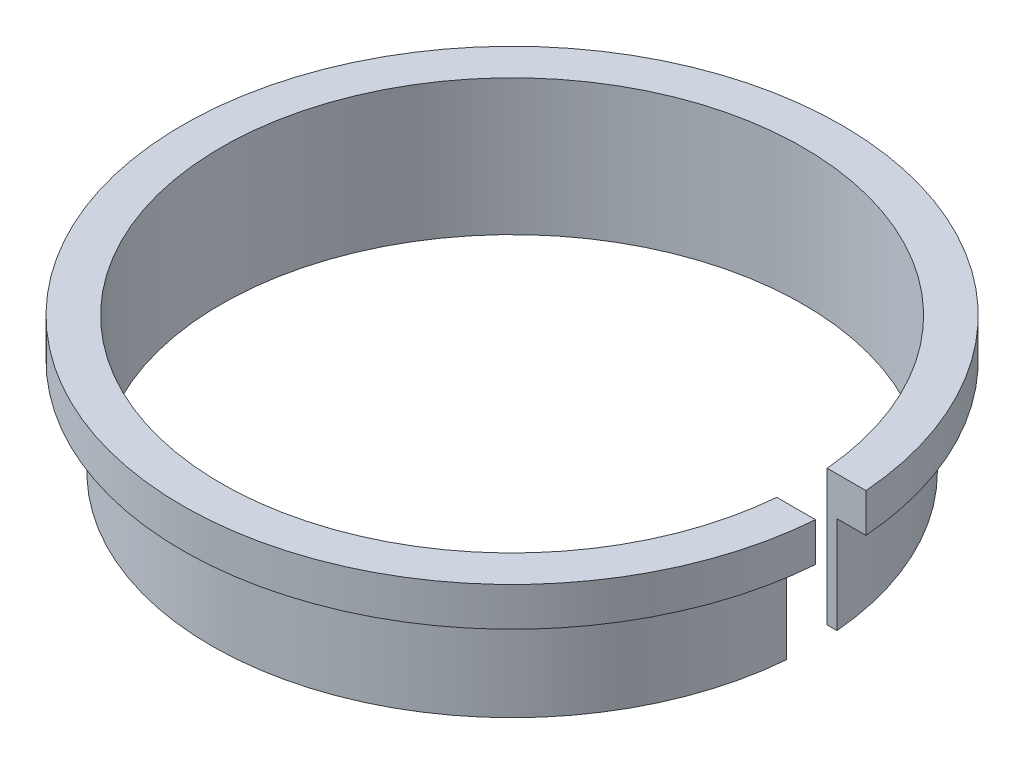
ISO-10303-21;
HEADER;
FILE_DESCRIPTION(('STEP AP214'),'2;1');
FILE_NAME('part.step','',(''),(''),'','','');
FILE_SCHEMA(('AUTOMOTIVE_DESIGN { 1 0 10303 214 1 1 1 1 }'));
ENDSEC;
DATA;
#1=APPLICATION_CONTEXT('core data for automotive mechanical design processes');
#2=APPLICATION_PROTOCOL_DEFINITION('international standard','automotive_design',2000,#1);
#3=PRODUCT_CONTEXT('',#1,'mechanical');
#4=PRODUCT('Part','Part','',(#3));
#5=PRODUCT_RELATED_PRODUCT_CATEGORY('part','',(#4));
#6=PRODUCT_DEFINITION_FORMATION('','',#4);
#7=PRODUCT_DEFINITION_CONTEXT('part definition',#1,'design');
#8=PRODUCT_DEFINITION('design','',#6,#7);
#9=PRODUCT_DEFINITION_SHAPE('','',#8);
#10=(LENGTH_UNIT() NAMED_UNIT(*) SI_UNIT(.MILLI.,.METRE.));
#11=(NAMED_UNIT(*) PLANE_ANGLE_UNIT() SI_UNIT($,.RADIAN.));
#12=(NAMED_UNIT(*) SI_UNIT($,.STERADIAN.) SOLID_ANGLE_UNIT());
#13=UNCERTAINTY_MEASURE_WITH_UNIT(LENGTH_MEASURE(1.E-05),#10,'distance_accuracy_value','');
#14=(GEOMETRIC_REPRESENTATION_CONTEXT(3) GLOBAL_UNCERTAINTY_ASSIGNED_CONTEXT((#13)) GLOBAL_UNIT_ASSIGNED_CONTEXT((#10,
#11,#12)) REPRESENTATION_CONTEXT('',''));
#15=CARTESIAN_POINT('',(0.,0.,0.));
#16=DIRECTION('',(0.,0.,1.));
#17=DIRECTION('',(1.,0.,0.));
#18=AXIS2_PLACEMENT_3D('',#15,#16,#17);
#19=CARTESIAN_POINT('',(0.,7.,0.));
#20=DIRECTION('',(0.,-1.,0.));
#21=DIRECTION('',(0.,0.,-1.));
#22=AXIS2_PLACEMENT_3D('',#19,#20,#21);
#23=CYLINDRICAL_SURFACE('',#22,15.5);
#24=CARTESIAN_POINT('',(0.,5.,0.));
#25=DIRECTION('',(0.,1.,0.));
#26=DIRECTION('',(0.,0.,1.));
#27=AXIS2_PLACEMENT_3D('',#24,#25,#26);
#28=CIRCLE('',#27,15.5);
#29=CARTESIAN_POINT('',(15.4454612043098,5.,-1.2991259316015));
#30=VERTEX_POINT('',#29);
#31=CARTESIAN_POINT('',(15.4454612043098,5.,1.2991259316015));
#32=VERTEX_POINT('',#31);
#33=EDGE_CURVE('E120',#30,#32,#28,.T.);
#34=ORIENTED_EDGE('',*,*,#33,.F.);
#35=DIRECTION('',(0.,-1.,0.));
#36=VECTOR('',#35,1.);
#37=CARTESIAN_POINT('',(15.4454612043098,7.,-1.2991259316015));
#38=LINE('',#37,#36);
#39=CARTESIAN_POINT('',(15.4454612043098,0.,-1.2991259316015));
#40=VERTEX_POINT('',#39);
#41=EDGE_CURVE('E63',#30,#40,#38,.T.);
#42=ORIENTED_EDGE('',*,*,#41,.T.);
#43=CARTESIAN_POINT('',(0.,0.,0.));
#44=DIRECTION('',(0.,1.,0.));
#45=DIRECTION('',(0.,0.,1.));
#46=AXIS2_PLACEMENT_3D('',#43,#44,#45);
#47=CIRCLE('',#46,15.5);
#48=CARTESIAN_POINT('',(15.4454612043098,0.,1.2991259316015));
#49=VERTEX_POINT('',#48);
#50=EDGE_CURVE('E116',#40,#49,#47,.T.);
#51=ORIENTED_EDGE('',*,*,#50,.T.);
#52=DIRECTION('',(0.,-1.,0.));
#53=VECTOR('',#52,1.);
#54=CARTESIAN_POINT('',(15.4454612043098,7.,1.2991259316015));
#55=LINE('',#54,#53);
#56=EDGE_CURVE('E101',#49,#32,#55,.F.);
#57=ORIENTED_EDGE('',*,*,#56,.T.);
#58=EDGE_LOOP('',(#34,#42,#51,#57));
#59=FACE_BOUND('',#58,.T.);
#60=ADVANCED_FACE('F41',(#59),#23,.T.);
#61=CARTESIAN_POINT('',(0.,7.,0.));
#62=DIRECTION('',(0.,1.,0.));
#63=DIRECTION('',(0.,0.,1.));
#64=AXIS2_PLACEMENT_3D('',#61,#62,#63);
#65=PLANE('',#64);
#66=DIRECTION('',(1.,0.,0.));
#67=VECTOR('',#66,1.);
#68=CARTESIAN_POINT('',(6.99,7.,-1.2991259316015));
#69=LINE('',#68,#67);
#70=CARTESIAN_POINT('',(14.9436364989865,7.,-1.2991259316015));
#71=VERTEX_POINT('',#70);
#72=CARTESIAN_POINT('',(16.9402589063403,7.,-1.2991259316015));
#73=VERTEX_POINT('',#72);
#74=EDGE_CURVE('E111',#71,#73,#69,.T.);
#75=ORIENTED_EDGE('',*,*,#74,.T.);
#76=CARTESIAN_POINT('',(0.,7.,0.));
#77=DIRECTION('',(0.,1.,0.));
#78=DIRECTION('',(0.,0.,1.));
#79=AXIS2_PLACEMENT_3D('',#76,#77,#78);
#80=CIRCLE('',#79,16.99);
#81=CARTESIAN_POINT('',(16.9402589063403,7.,1.2991259316015));
#82=VERTEX_POINT('',#81);
#83=EDGE_CURVE('E110',#73,#82,#80,.T.);
#84=ORIENTED_EDGE('',*,*,#83,.T.);
#85=DIRECTION('',(1.,0.,0.));
#86=VECTOR('',#85,1.);
#87=CARTESIAN_POINT('',(6.99,7.,1.2991259316015));
#88=LINE('',#87,#86);
#89=CARTESIAN_POINT('',(14.9436364989865,7.,1.2991259316015));
#90=VERTEX_POINT('',#89);
#91=EDGE_CURVE('E93',#90,#82,#88,.T.);
#92=ORIENTED_EDGE('',*,*,#91,.F.);
#93=CARTESIAN_POINT('',(0.,7.,0.));
#94=DIRECTION('',(0.,1.,0.));
#95=DIRECTION('',(0.,0.,1.));
#96=AXIS2_PLACEMENT_3D('',#93,#94,#95);
#97=CIRCLE('',#96,15.);
#98=EDGE_CURVE('E108',#71,#90,#97,.T.);
#99=ORIENTED_EDGE('',*,*,#98,.F.);
#100=EDGE_LOOP('',(#75,#84,#92,#99));
#101=FACE_BOUND('',#100,.T.);
#102=ADVANCED_FACE('F107',(#101),#65,.T.);
#103=CARTESIAN_POINT('',(0.,0.,0.));
#104=DIRECTION('',(0.,1.,0.));
#105=DIRECTION('',(0.,0.,1.));
#106=AXIS2_PLACEMENT_3D('',#103,#104,#105);
#107=PLANE('',#106);
#108=ORIENTED_EDGE('',*,*,#50,.F.);
#109=DIRECTION('',(1.,0.,0.));
#110=VECTOR('',#109,1.);
#111=CARTESIAN_POINT('',(6.99,0.,-1.2991259316015));
#112=LINE('',#111,#110);
#113=CARTESIAN_POINT('',(14.9436364989865,0.,-1.2991259316015));
#114=VERTEX_POINT('',#113);
#115=EDGE_CURVE('E143',#114,#40,#112,.T.);
#116=ORIENTED_EDGE('',*,*,#115,.F.);
#117=CARTESIAN_POINT('',(0.,0.,0.));
#118=DIRECTION('',(0.,1.,0.));
#119=DIRECTION('',(0.,0.,1.));
#120=AXIS2_PLACEMENT_3D('',#117,#118,#119);
#121=CIRCLE('',#120,15.);
#122=CARTESIAN_POINT('',(14.9436364989865,0.,1.2991259316015));
#123=VERTEX_POINT('',#122);
#124=EDGE_CURVE('E117',#114,#123,#121,.T.);
#125=ORIENTED_EDGE('',*,*,#124,.T.);
#126=DIRECTION('',(1.,0.,0.));
#127=VECTOR('',#126,1.);
#128=CARTESIAN_POINT('',(6.99,0.,1.2991259316015));
#129=LINE('',#128,#127);
#130=EDGE_CURVE('E95',#123,#49,#129,.T.);
#131=ORIENTED_EDGE('',*,*,#130,.T.);
#132=EDGE_LOOP('',(#108,#116,#125,#131));
#133=FACE_BOUND('',#132,.T.);
#134=ADVANCED_FACE('F151',(#133),#107,.F.);
#135=CARTESIAN_POINT('',(0.,7.,0.));
#136=DIRECTION('',(0.,-1.,0.));
#137=DIRECTION('',(0.,0.,-1.));
#138=AXIS2_PLACEMENT_3D('',#135,#136,#137);
#139=CYLINDRICAL_SURFACE('',#138,15.);
#140=DIRECTION('',(0.,-1.,0.));
#141=VECTOR('',#140,1.);
#142=CARTESIAN_POINT('',(14.9436364989865,7.,-1.2991259316015));
#143=LINE('',#142,#141);
#144=EDGE_CURVE('E115',#71,#114,#143,.T.);
#145=ORIENTED_EDGE('',*,*,#144,.F.);
#146=ORIENTED_EDGE('',*,*,#98,.T.);
#147=DIRECTION('',(0.,-1.,0.));
#148=VECTOR('',#147,1.);
#149=CARTESIAN_POINT('',(14.9436364989865,7.,1.2991259316015));
#150=LINE('',#149,#148);
#151=EDGE_CURVE('E90',#123,#90,#150,.F.);
#152=ORIENTED_EDGE('',*,*,#151,.F.);
#153=ORIENTED_EDGE('',*,*,#124,.F.);
#154=EDGE_LOOP('',(#145,#146,#152,#153));
#155=FACE_BOUND('',#154,.T.);
#156=ADVANCED_FACE('F114',(#155),#139,.F.);
#157=CARTESIAN_POINT('',(0.,5.,0.));
#158=DIRECTION('',(0.,1.,0.));
#159=DIRECTION('',(0.,0.,1.));
#160=AXIS2_PLACEMENT_3D('',#157,#158,#159);
#161=CYLINDRICAL_SURFACE('',#160,16.99);
#162=DIRECTION('',(0.,1.,0.));
#163=VECTOR('',#162,1.);
#164=CARTESIAN_POINT('',(16.9402589063403,5.,-1.2991259316015));
#165=LINE('',#164,#163);
#166=CARTESIAN_POINT('',(16.9402589063403,5.,-1.2991259316015));
#167=VERTEX_POINT('',#166);
#168=EDGE_CURVE('E100',#167,#73,#165,.T.);
#169=ORIENTED_EDGE('',*,*,#168,.F.);
#170=CARTESIAN_POINT('',(0.,5.,0.));
#171=DIRECTION('',(0.,1.,0.));
#172=DIRECTION('',(0.,0.,1.));
#173=AXIS2_PLACEMENT_3D('',#170,#171,#172);
#174=CIRCLE('',#173,16.99);
#175=CARTESIAN_POINT('',(16.9402589063403,5.,1.2991259316015));
#176=VERTEX_POINT('',#175);
#177=EDGE_CURVE('E122',#167,#176,#174,.T.);
#178=ORIENTED_EDGE('',*,*,#177,.T.);
#179=DIRECTION('',(0.,1.,0.));
#180=VECTOR('',#179,1.);
#181=CARTESIAN_POINT('',(16.9402589063403,5.,1.2991259316015));
#182=LINE('',#181,#180);
#183=EDGE_CURVE('E55',#82,#176,#182,.F.);
#184=ORIENTED_EDGE('',*,*,#183,.F.);
#185=ORIENTED_EDGE('',*,*,#83,.F.);
#186=EDGE_LOOP('',(#169,#178,#184,#185));
#187=FACE_BOUND('',#186,.T.);
#188=ADVANCED_FACE('F136',(#187),#161,.T.);
#189=CARTESIAN_POINT('',(0.,5.,0.));
#190=DIRECTION('',(0.,1.,0.));
#191=DIRECTION('',(0.,0.,1.));
#192=AXIS2_PLACEMENT_3D('',#189,#190,#191);
#193=PLANE('',#192);
#194=ORIENTED_EDGE('',*,*,#177,.F.);
#195=DIRECTION('',(-1.,0.,0.));
#196=VECTOR('',#195,1.);
#197=CARTESIAN_POINT('',(0.,5.,-1.2991259316015));
#198=LINE('',#197,#196);
#199=EDGE_CURVE('E11',#167,#30,#198,.T.);
#200=ORIENTED_EDGE('',*,*,#199,.T.);
#201=ORIENTED_EDGE('',*,*,#33,.T.);
#202=DIRECTION('',(1.,0.,0.));
#203=VECTOR('',#202,1.);
#204=CARTESIAN_POINT('',(0.,5.,1.2991259316015));
#205=LINE('',#204,#203);
#206=EDGE_CURVE('E48',#32,#176,#205,.T.);
#207=ORIENTED_EDGE('',*,*,#206,.T.);
#208=EDGE_LOOP('',(#194,#200,#201,#207));
#209=FACE_BOUND('',#208,.T.);
#210=ADVANCED_FACE('F131',(#209),#193,.F.);
#211=CARTESIAN_POINT('',(6.99,7.,1.2991259316015));
#212=DIRECTION('',(0.,0.,1.));
#213=DIRECTION('',(0.,-1.,0.));
#214=AXIS2_PLACEMENT_3D('',#211,#212,#213);
#215=PLANE('',#214);
#216=ORIENTED_EDGE('',*,*,#151,.T.);
#217=ORIENTED_EDGE('',*,*,#91,.T.);
#218=ORIENTED_EDGE('',*,*,#183,.T.);
#219=ORIENTED_EDGE('',*,*,#206,.F.);
#220=ORIENTED_EDGE('',*,*,#56,.F.);
#221=ORIENTED_EDGE('',*,*,#130,.F.);
#222=EDGE_LOOP('',(#216,#217,#218,#219,#220,#221));
#223=FACE_BOUND('',#222,.T.);
#224=ADVANCED_FACE('F92',(#223),#215,.F.);
#225=CARTESIAN_POINT('',(6.99,7.,-1.2991259316015));
#226=DIRECTION('',(0.,0.,-1.));
#227=DIRECTION('',(-1.,0.,0.));
#228=AXIS2_PLACEMENT_3D('',#225,#226,#227);
#229=PLANE('',#228);
#230=ORIENTED_EDGE('',*,*,#144,.T.);
#231=ORIENTED_EDGE('',*,*,#115,.T.);
#232=ORIENTED_EDGE('',*,*,#41,.F.);
#233=ORIENTED_EDGE('',*,*,#199,.F.);
#234=ORIENTED_EDGE('',*,*,#168,.T.);
#235=ORIENTED_EDGE('',*,*,#74,.F.);
#236=EDGE_LOOP('',(#230,#231,#232,#233,#234,#235));
#237=FACE_BOUND('',#236,.T.);
#238=ADVANCED_FACE('F147',(#237),#229,.F.);
#239=CLOSED_SHELL('',(#60,#102,#134,#156,#188,#210,#224,#238));
#240=MANIFOLD_SOLID_BREP('B2',#239);
#241=ADVANCED_BREP_SHAPE_REPRESENTATION('',(#18,#240),#14);
#242=SHAPE_DEFINITION_REPRESENTATION(#9,#241);
ENDSEC;
END-ISO-10303-21;
